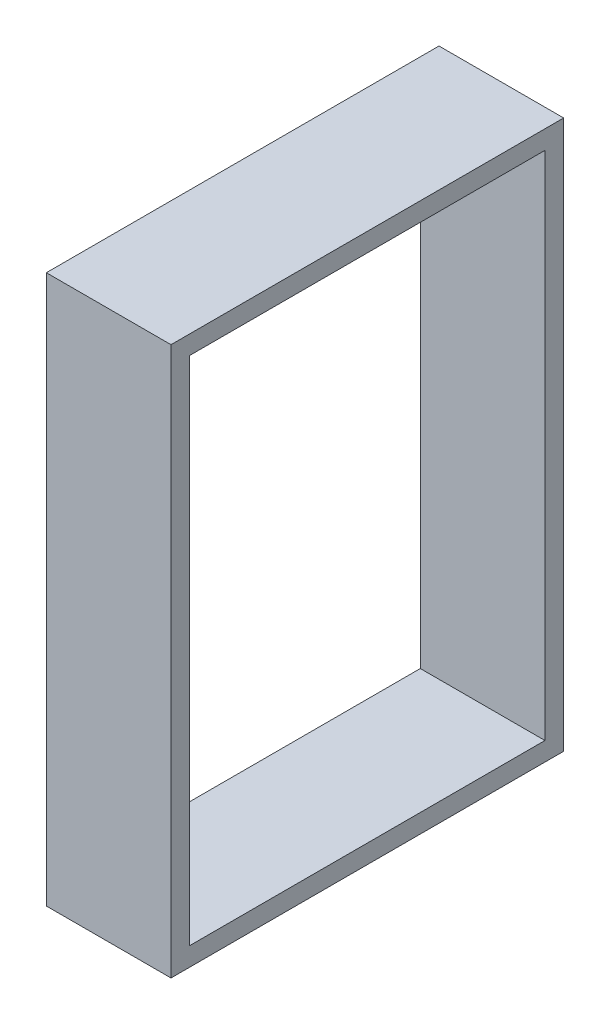
ISO-10303-21;
HEADER;
FILE_DESCRIPTION(('STEP AP214'),'2;1');
FILE_NAME('part.step','',(''),(''),'','','');
FILE_SCHEMA(('AUTOMOTIVE_DESIGN { 1 0 10303 214 1 1 1 1 }'));
ENDSEC;
DATA;
#1=APPLICATION_CONTEXT('core data for automotive mechanical design processes');
#2=APPLICATION_PROTOCOL_DEFINITION('international standard','automotive_design',2000,#1);
#3=PRODUCT_CONTEXT('',#1,'mechanical');
#4=PRODUCT('Part','Part','',(#3));
#5=PRODUCT_RELATED_PRODUCT_CATEGORY('part','',(#4));
#6=PRODUCT_DEFINITION_FORMATION('','',#4);
#7=PRODUCT_DEFINITION_CONTEXT('part definition',#1,'design');
#8=PRODUCT_DEFINITION('design','',#6,#7);
#9=PRODUCT_DEFINITION_SHAPE('','',#8);
#10=(LENGTH_UNIT() NAMED_UNIT(*) SI_UNIT(.MILLI.,.METRE.));
#11=(NAMED_UNIT(*) PLANE_ANGLE_UNIT() SI_UNIT($,.RADIAN.));
#12=(NAMED_UNIT(*) SI_UNIT($,.STERADIAN.) SOLID_ANGLE_UNIT());
#13=UNCERTAINTY_MEASURE_WITH_UNIT(LENGTH_MEASURE(1.E-05),#10,'distance_accuracy_value','');
#14=(GEOMETRIC_REPRESENTATION_CONTEXT(3) GLOBAL_UNCERTAINTY_ASSIGNED_CONTEXT((#13)) GLOBAL_UNIT_ASSIGNED_CONTEXT((#10,
#11,#12)) REPRESENTATION_CONTEXT('',''));
#15=CARTESIAN_POINT('',(0.,0.,0.));
#16=DIRECTION('',(0.,0.,1.));
#17=DIRECTION('',(1.,0.,0.));
#18=AXIS2_PLACEMENT_3D('',#15,#16,#17);
#19=CARTESIAN_POINT('',(-250.,-48.5,80.));
#20=DIRECTION('',(0.,-1.,0.));
#21=DIRECTION('',(0.,0.,-1.));
#22=AXIS2_PLACEMENT_3D('',#19,#20,#21);
#23=PLANE('',#22);
#24=DIRECTION('',(0.,0.,-1.));
#25=VECTOR('',#24,1.);
#26=CARTESIAN_POINT('',(-240.,-48.5,80.));
#27=LINE('',#26,#25);
#28=CARTESIAN_POINT('',(-240.,-48.5,80.));
#29=VERTEX_POINT('',#28);
#30=CARTESIAN_POINT('',(-240.,-48.5,48.5));
#31=VERTEX_POINT('',#30);
#32=EDGE_CURVE('E136',#29,#31,#27,.T.);
#33=ORIENTED_EDGE('',*,*,#32,.F.);
#34=DIRECTION('',(1.,0.,0.));
#35=VECTOR('',#34,1.);
#36=CARTESIAN_POINT('',(-250.,-48.5,80.));
#37=LINE('',#36,#35);
#38=CARTESIAN_POINT('',(-250.,-48.5,80.));
#39=VERTEX_POINT('',#38);
#40=EDGE_CURVE('E11',#39,#29,#37,.T.);
#41=ORIENTED_EDGE('',*,*,#40,.F.);
#42=DIRECTION('',(0.,0.,-1.));
#43=VECTOR('',#42,1.);
#44=CARTESIAN_POINT('',(-250.,-48.5,80.));
#45=LINE('',#44,#43);
#46=CARTESIAN_POINT('',(-250.,-48.5,48.5));
#47=VERTEX_POINT('',#46);
#48=EDGE_CURVE('E141',#39,#47,#45,.T.);
#49=ORIENTED_EDGE('',*,*,#48,.T.);
#50=DIRECTION('',(1.,0.,0.));
#51=VECTOR('',#50,1.);
#52=CARTESIAN_POINT('',(-250.,-48.5,48.5));
#53=LINE('',#52,#51);
#54=EDGE_CURVE('E42',#47,#31,#53,.T.);
#55=ORIENTED_EDGE('',*,*,#54,.T.);
#56=EDGE_LOOP('',(#33,#41,#49,#55));
#57=FACE_BOUND('',#56,.T.);
#58=ADVANCED_FACE('F41',(#57),#23,.T.);
#59=CARTESIAN_POINT('',(-250.,-48.5,80.));
#60=DIRECTION('',(0.,0.,1.));
#61=DIRECTION('',(1.,0.,0.));
#62=AXIS2_PLACEMENT_3D('',#59,#60,#61);
#63=PLANE('',#62);
#64=DIRECTION('',(0.,-1.,0.));
#65=VECTOR('',#64,1.);
#66=CARTESIAN_POINT('',(-240.,-48.5,80.));
#67=LINE('',#66,#65);
#68=CARTESIAN_POINT('',(-240.,-4.5,80.));
#69=VERTEX_POINT('',#68);
#70=EDGE_CURVE('E150',#69,#29,#67,.T.);
#71=ORIENTED_EDGE('',*,*,#70,.F.);
#72=DIRECTION('',(1.,0.,0.));
#73=VECTOR('',#72,1.);
#74=CARTESIAN_POINT('',(-250.,-4.5,80.));
#75=LINE('',#74,#73);
#76=CARTESIAN_POINT('',(-250.,-4.5,80.));
#77=VERTEX_POINT('',#76);
#78=EDGE_CURVE('E47',#77,#69,#75,.T.);
#79=ORIENTED_EDGE('',*,*,#78,.F.);
#80=DIRECTION('',(0.,-1.,0.));
#81=VECTOR('',#80,1.);
#82=CARTESIAN_POINT('',(-250.,-48.5,80.));
#83=LINE('',#82,#81);
#84=EDGE_CURVE('E153',#77,#39,#83,.T.);
#85=ORIENTED_EDGE('',*,*,#84,.T.);
#86=ORIENTED_EDGE('',*,*,#40,.T.);
#87=EDGE_LOOP('',(#71,#79,#85,#86));
#88=FACE_BOUND('',#87,.T.);
#89=ADVANCED_FACE('F176',(#88),#63,.T.);
#90=CARTESIAN_POINT('',(-250.,-4.5,80.));
#91=DIRECTION('',(0.,1.,0.));
#92=DIRECTION('',(0.,0.,1.));
#93=AXIS2_PLACEMENT_3D('',#90,#91,#92);
#94=PLANE('',#93);
#95=DIRECTION('',(0.,0.,1.));
#96=VECTOR('',#95,1.);
#97=CARTESIAN_POINT('',(-240.,-4.5,80.));
#98=LINE('',#97,#96);
#99=CARTESIAN_POINT('',(-240.,-4.5,48.5));
#100=VERTEX_POINT('',#99);
#101=EDGE_CURVE('E161',#100,#69,#98,.T.);
#102=ORIENTED_EDGE('',*,*,#101,.F.);
#103=DIRECTION('',(1.,0.,0.));
#104=VECTOR('',#103,1.);
#105=CARTESIAN_POINT('',(-250.,-4.5,48.5));
#106=LINE('',#105,#104);
#107=CARTESIAN_POINT('',(-250.,-4.5,48.5));
#108=VERTEX_POINT('',#107);
#109=EDGE_CURVE('E167',#108,#100,#106,.T.);
#110=ORIENTED_EDGE('',*,*,#109,.F.);
#111=DIRECTION('',(0.,0.,1.));
#112=VECTOR('',#111,1.);
#113=CARTESIAN_POINT('',(-250.,-4.5,80.));
#114=LINE('',#113,#112);
#115=EDGE_CURVE('E147',#108,#77,#114,.T.);
#116=ORIENTED_EDGE('',*,*,#115,.T.);
#117=ORIENTED_EDGE('',*,*,#78,.T.);
#118=EDGE_LOOP('',(#102,#110,#116,#117));
#119=FACE_BOUND('',#118,.T.);
#120=ADVANCED_FACE('F181',(#119),#94,.T.);
#121=CARTESIAN_POINT('',(-250.,-48.5,48.5));
#122=DIRECTION('',(0.,0.,-1.));
#123=DIRECTION('',(-1.,0.,0.));
#124=AXIS2_PLACEMENT_3D('',#121,#122,#123);
#125=PLANE('',#124);
#126=DIRECTION('',(0.,1.,0.));
#127=VECTOR('',#126,1.);
#128=CARTESIAN_POINT('',(-240.,-48.5,48.5));
#129=LINE('',#128,#127);
#130=EDGE_CURVE('E158',#31,#100,#129,.T.);
#131=ORIENTED_EDGE('',*,*,#130,.F.);
#132=ORIENTED_EDGE('',*,*,#54,.F.);
#133=DIRECTION('',(0.,1.,0.));
#134=VECTOR('',#133,1.);
#135=CARTESIAN_POINT('',(-250.,-48.5,48.5));
#136=LINE('',#135,#134);
#137=EDGE_CURVE('E148',#47,#108,#136,.T.);
#138=ORIENTED_EDGE('',*,*,#137,.T.);
#139=ORIENTED_EDGE('',*,*,#109,.T.);
#140=EDGE_LOOP('',(#131,#132,#138,#139));
#141=FACE_BOUND('',#140,.T.);
#142=ADVANCED_FACE('F171',(#141),#125,.T.);
#143=CARTESIAN_POINT('',(-250.,0.,0.));
#144=DIRECTION('',(1.,0.,0.));
#145=DIRECTION('',(0.,0.,-1.));
#146=AXIS2_PLACEMENT_3D('',#143,#144,#145);
#147=PLANE('',#146);
#148=DIRECTION('',(0.,-1.,0.));
#149=VECTOR('',#148,1.);
#150=CARTESIAN_POINT('',(-250.,-47.,78.5));
#151=LINE('',#150,#149);
#152=CARTESIAN_POINT('',(-250.,-6.,78.5));
#153=VERTEX_POINT('',#152);
#154=CARTESIAN_POINT('',(-250.,-47.,78.5));
#155=VERTEX_POINT('',#154);
#156=EDGE_CURVE('E111',#153,#155,#151,.T.);
#157=ORIENTED_EDGE('',*,*,#156,.T.);
#158=DIRECTION('',(0.,0.,-1.));
#159=VECTOR('',#158,1.);
#160=CARTESIAN_POINT('',(-250.,-47.,78.5));
#161=LINE('',#160,#159);
#162=CARTESIAN_POINT('',(-250.,-47.,50.));
#163=VERTEX_POINT('',#162);
#164=EDGE_CURVE('E107',#155,#163,#161,.T.);
#165=ORIENTED_EDGE('',*,*,#164,.T.);
#166=DIRECTION('',(0.,1.,0.));
#167=VECTOR('',#166,1.);
#168=CARTESIAN_POINT('',(-250.,-47.,50.));
#169=LINE('',#168,#167);
#170=CARTESIAN_POINT('',(-250.,-6.,50.));
#171=VERTEX_POINT('',#170);
#172=EDGE_CURVE('E120',#163,#171,#169,.T.);
#173=ORIENTED_EDGE('',*,*,#172,.T.);
#174=DIRECTION('',(0.,0.,1.));
#175=VECTOR('',#174,1.);
#176=CARTESIAN_POINT('',(-250.,-6.,78.5));
#177=LINE('',#176,#175);
#178=EDGE_CURVE('E60',#171,#153,#177,.T.);
#179=ORIENTED_EDGE('',*,*,#178,.T.);
#180=EDGE_LOOP('',(#157,#165,#173,#179));
#181=FACE_BOUND('',#180,.T.);
#182=ORIENTED_EDGE('',*,*,#48,.F.);
#183=ORIENTED_EDGE('',*,*,#84,.F.);
#184=ORIENTED_EDGE('',*,*,#115,.F.);
#185=ORIENTED_EDGE('',*,*,#137,.F.);
#186=EDGE_LOOP('',(#182,#183,#184,#185));
#187=FACE_BOUND('',#186,.T.);
#188=ADVANCED_FACE('F122',(#181,#187),#147,.F.);
#189=CARTESIAN_POINT('',(-240.,0.,0.));
#190=DIRECTION('',(1.,0.,0.));
#191=DIRECTION('',(0.,0.,-1.));
#192=AXIS2_PLACEMENT_3D('',#189,#190,#191);
#193=PLANE('',#192);
#194=DIRECTION('',(0.,0.,-1.));
#195=VECTOR('',#194,1.);
#196=CARTESIAN_POINT('',(-240.,-47.,78.5));
#197=LINE('',#196,#195);
#198=CARTESIAN_POINT('',(-240.,-47.,78.5));
#199=VERTEX_POINT('',#198);
#200=CARTESIAN_POINT('',(-240.,-47.,50.));
#201=VERTEX_POINT('',#200);
#202=EDGE_CURVE('E63',#199,#201,#197,.T.);
#203=ORIENTED_EDGE('',*,*,#202,.F.);
#204=DIRECTION('',(0.,-1.,0.));
#205=VECTOR('',#204,1.);
#206=CARTESIAN_POINT('',(-240.,-47.,78.5));
#207=LINE('',#206,#205);
#208=CARTESIAN_POINT('',(-240.,-6.,78.5));
#209=VERTEX_POINT('',#208);
#210=EDGE_CURVE('E121',#209,#199,#207,.T.);
#211=ORIENTED_EDGE('',*,*,#210,.F.);
#212=DIRECTION('',(0.,0.,1.));
#213=VECTOR('',#212,1.);
#214=CARTESIAN_POINT('',(-240.,-6.,78.5));
#215=LINE('',#214,#213);
#216=CARTESIAN_POINT('',(-240.,-6.,50.));
#217=VERTEX_POINT('',#216);
#218=EDGE_CURVE('E130',#217,#209,#215,.T.);
#219=ORIENTED_EDGE('',*,*,#218,.F.);
#220=DIRECTION('',(0.,1.,0.));
#221=VECTOR('',#220,1.);
#222=CARTESIAN_POINT('',(-240.,-47.,50.));
#223=LINE('',#222,#221);
#224=EDGE_CURVE('E134',#201,#217,#223,.T.);
#225=ORIENTED_EDGE('',*,*,#224,.F.);
#226=EDGE_LOOP('',(#203,#211,#219,#225));
#227=FACE_BOUND('',#226,.T.);
#228=ORIENTED_EDGE('',*,*,#32,.T.);
#229=ORIENTED_EDGE('',*,*,#130,.T.);
#230=ORIENTED_EDGE('',*,*,#101,.T.);
#231=ORIENTED_EDGE('',*,*,#70,.T.);
#232=EDGE_LOOP('',(#228,#229,#230,#231));
#233=FACE_BOUND('',#232,.T.);
#234=ADVANCED_FACE('F177',(#227,#233),#193,.T.);
#235=CARTESIAN_POINT('',(-250.,-47.,78.5));
#236=DIRECTION('',(0.,-1.,0.));
#237=DIRECTION('',(0.,0.,-1.));
#238=AXIS2_PLACEMENT_3D('',#235,#236,#237);
#239=PLANE('',#238);
#240=ORIENTED_EDGE('',*,*,#202,.T.);
#241=DIRECTION('',(1.,0.,0.));
#242=VECTOR('',#241,1.);
#243=CARTESIAN_POINT('',(-250.,-47.,50.));
#244=LINE('',#243,#242);
#245=EDGE_CURVE('E102',#163,#201,#244,.T.);
#246=ORIENTED_EDGE('',*,*,#245,.F.);
#247=ORIENTED_EDGE('',*,*,#164,.F.);
#248=DIRECTION('',(1.,0.,0.));
#249=VECTOR('',#248,1.);
#250=CARTESIAN_POINT('',(-250.,-47.,78.5));
#251=LINE('',#250,#249);
#252=EDGE_CURVE('E140',#155,#199,#251,.T.);
#253=ORIENTED_EDGE('',*,*,#252,.T.);
#254=EDGE_LOOP('',(#240,#246,#247,#253));
#255=FACE_BOUND('',#254,.T.);
#256=ADVANCED_FACE('F106',(#255),#239,.F.);
#257=CARTESIAN_POINT('',(-250.,-47.,78.5));
#258=DIRECTION('',(0.,0.,1.));
#259=DIRECTION('',(1.,0.,0.));
#260=AXIS2_PLACEMENT_3D('',#257,#258,#259);
#261=PLANE('',#260);
#262=ORIENTED_EDGE('',*,*,#210,.T.);
#263=ORIENTED_EDGE('',*,*,#252,.F.);
#264=ORIENTED_EDGE('',*,*,#156,.F.);
#265=DIRECTION('',(1.,0.,0.));
#266=VECTOR('',#265,1.);
#267=CARTESIAN_POINT('',(-250.,-6.,78.5));
#268=LINE('',#267,#266);
#269=EDGE_CURVE('E138',#153,#209,#268,.T.);
#270=ORIENTED_EDGE('',*,*,#269,.T.);
#271=EDGE_LOOP('',(#262,#263,#264,#270));
#272=FACE_BOUND('',#271,.T.);
#273=ADVANCED_FACE('F237',(#272),#261,.F.);
#274=CARTESIAN_POINT('',(-250.,-6.,78.5));
#275=DIRECTION('',(0.,1.,0.));
#276=DIRECTION('',(0.,0.,1.));
#277=AXIS2_PLACEMENT_3D('',#274,#275,#276);
#278=PLANE('',#277);
#279=ORIENTED_EDGE('',*,*,#218,.T.);
#280=ORIENTED_EDGE('',*,*,#269,.F.);
#281=ORIENTED_EDGE('',*,*,#178,.F.);
#282=DIRECTION('',(1.,0.,0.));
#283=VECTOR('',#282,1.);
#284=CARTESIAN_POINT('',(-250.,-6.,50.));
#285=LINE('',#284,#283);
#286=EDGE_CURVE('E114',#171,#217,#285,.T.);
#287=ORIENTED_EDGE('',*,*,#286,.T.);
#288=EDGE_LOOP('',(#279,#280,#281,#287));
#289=FACE_BOUND('',#288,.T.);
#290=ADVANCED_FACE('F243',(#289),#278,.F.);
#291=CARTESIAN_POINT('',(-250.,-47.,50.));
#292=DIRECTION('',(0.,0.,-1.));
#293=DIRECTION('',(-1.,0.,0.));
#294=AXIS2_PLACEMENT_3D('',#291,#292,#293);
#295=PLANE('',#294);
#296=ORIENTED_EDGE('',*,*,#224,.T.);
#297=ORIENTED_EDGE('',*,*,#286,.F.);
#298=ORIENTED_EDGE('',*,*,#172,.F.);
#299=ORIENTED_EDGE('',*,*,#245,.T.);
#300=EDGE_LOOP('',(#296,#297,#298,#299));
#301=FACE_BOUND('',#300,.T.);
#302=ADVANCED_FACE('F119',(#301),#295,.F.);
#303=CLOSED_SHELL('',(#58,#89,#120,#142,#188,#234,#256,#273,#290,#302));
#304=MANIFOLD_SOLID_BREP('B2',#303);
#305=ADVANCED_BREP_SHAPE_REPRESENTATION('',(#18,#304),#14);
#306=SHAPE_DEFINITION_REPRESENTATION(#9,#305);
ENDSEC;
END-ISO-10303-21;
